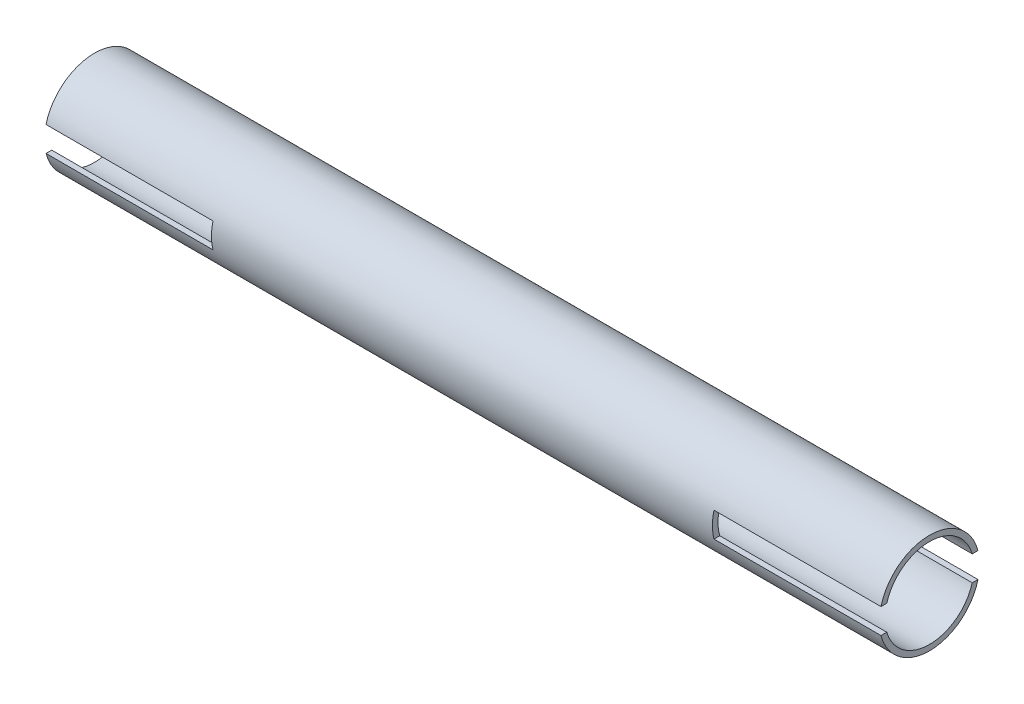
ISO-10303-21;
HEADER;
FILE_DESCRIPTION(('STEP AP214'),'2;1');
FILE_NAME('part.step','',(''),(''),'','','');
FILE_SCHEMA(('AUTOMOTIVE_DESIGN { 1 0 10303 214 1 1 1 1 }'));
ENDSEC;
DATA;
#1=APPLICATION_CONTEXT('core data for automotive mechanical design processes');
#2=APPLICATION_PROTOCOL_DEFINITION('international standard','automotive_design',2000,#1);
#3=PRODUCT_CONTEXT('',#1,'mechanical');
#4=PRODUCT('Part','Part','',(#3));
#5=PRODUCT_RELATED_PRODUCT_CATEGORY('part','',(#4));
#6=PRODUCT_DEFINITION_FORMATION('','',#4);
#7=PRODUCT_DEFINITION_CONTEXT('part definition',#1,'design');
#8=PRODUCT_DEFINITION('design','',#6,#7);
#9=PRODUCT_DEFINITION_SHAPE('','',#8);
#10=(LENGTH_UNIT() NAMED_UNIT(*) SI_UNIT(.MILLI.,.METRE.));
#11=(NAMED_UNIT(*) PLANE_ANGLE_UNIT() SI_UNIT($,.RADIAN.));
#12=(NAMED_UNIT(*) SI_UNIT($,.STERADIAN.) SOLID_ANGLE_UNIT());
#13=UNCERTAINTY_MEASURE_WITH_UNIT(LENGTH_MEASURE(1.E-05),#10,'distance_accuracy_value','');
#14=(GEOMETRIC_REPRESENTATION_CONTEXT(3) GLOBAL_UNCERTAINTY_ASSIGNED_CONTEXT((#13)) GLOBAL_UNIT_ASSIGNED_CONTEXT((#10,
#11,#12)) REPRESENTATION_CONTEXT('',''));
#15=CARTESIAN_POINT('',(0.,0.,0.));
#16=DIRECTION('',(0.,0.,1.));
#17=DIRECTION('',(1.,0.,0.));
#18=AXIS2_PLACEMENT_3D('',#15,#16,#17);
#19=CARTESIAN_POINT('',(-158.75,0.,0.));
#20=DIRECTION('',(1.,0.,0.));
#21=DIRECTION('',(0.,0.,-1.));
#22=AXIS2_PLACEMENT_3D('',#19,#20,#21);
#23=CYLINDRICAL_SURFACE('',#22,16.9418);
#24=DIRECTION('',(1.,0.,0.));
#25=VECTOR('',#24,1.);
#26=CARTESIAN_POINT('',(158.75,4.7625,16.2586340444093));
#27=LINE('',#26,#25);
#28=CARTESIAN_POINT('',(158.75,4.7625,16.2586340444089));
#29=VERTEX_POINT('',#28);
#30=CARTESIAN_POINT('',(95.25,4.7625,16.2586340444089));
#31=VERTEX_POINT('',#30);
#32=EDGE_CURVE('E156',#29,#31,#27,.F.);
#33=ORIENTED_EDGE('',*,*,#32,.T.);
#34=CARTESIAN_POINT('',(95.25,0.,0.));
#35=DIRECTION('',(1.,0.,0.));
#36=DIRECTION('',(0.,0.,-1.));
#37=AXIS2_PLACEMENT_3D('',#34,#35,#36);
#38=CIRCLE('',#37,16.9418);
#39=CARTESIAN_POINT('',(95.25,-4.7625,16.2586340444089));
#40=VERTEX_POINT('',#39);
#41=EDGE_CURVE('E210',#31,#40,#38,.T.);
#42=ORIENTED_EDGE('',*,*,#41,.T.);
#43=DIRECTION('',(1.,0.,0.));
#44=VECTOR('',#43,1.);
#45=CARTESIAN_POINT('',(95.25,-4.7625,16.2586340444093));
#46=LINE('',#45,#44);
#47=CARTESIAN_POINT('',(158.75,-4.7625,16.2586340444089));
#48=VERTEX_POINT('',#47);
#49=EDGE_CURVE('E159',#40,#48,#46,.T.);
#50=ORIENTED_EDGE('',*,*,#49,.T.);
#51=CARTESIAN_POINT('',(158.75,0.,0.));
#52=DIRECTION('',(1.,0.,0.));
#53=DIRECTION('',(0.,0.,-1.));
#54=AXIS2_PLACEMENT_3D('',#51,#52,#53);
#55=CIRCLE('',#54,16.9418);
#56=CARTESIAN_POINT('',(158.75,-4.7625,-16.2586340444089));
#57=VERTEX_POINT('',#56);
#58=EDGE_CURVE('E162',#57,#48,#55,.F.);
#59=ORIENTED_EDGE('',*,*,#58,.F.);
#60=DIRECTION('',(1.,0.,0.));
#61=VECTOR('',#60,1.);
#62=CARTESIAN_POINT('',(95.25,-4.7625,-16.2586340444093));
#63=LINE('',#62,#61);
#64=CARTESIAN_POINT('',(95.25,-4.7625,-16.2586340444089));
#65=VERTEX_POINT('',#64);
#66=EDGE_CURVE('E163',#57,#65,#63,.F.);
#67=ORIENTED_EDGE('',*,*,#66,.T.);
#68=CARTESIAN_POINT('',(95.25,0.,0.));
#69=DIRECTION('',(1.,0.,0.));
#70=DIRECTION('',(0.,0.,-1.));
#71=AXIS2_PLACEMENT_3D('',#68,#69,#70);
#72=CIRCLE('',#71,16.9418);
#73=CARTESIAN_POINT('',(95.25,4.7625,-16.2586340444089));
#74=VERTEX_POINT('',#73);
#75=EDGE_CURVE('E215',#65,#74,#72,.T.);
#76=ORIENTED_EDGE('',*,*,#75,.T.);
#77=DIRECTION('',(1.,0.,0.));
#78=VECTOR('',#77,1.);
#79=CARTESIAN_POINT('',(158.75,4.7625,-16.2586340444093));
#80=LINE('',#79,#78);
#81=CARTESIAN_POINT('',(158.75,4.7625,-16.2586340444089));
#82=VERTEX_POINT('',#81);
#83=EDGE_CURVE('E167',#74,#82,#80,.T.);
#84=ORIENTED_EDGE('',*,*,#83,.T.);
#85=CARTESIAN_POINT('',(158.75,0.,0.));
#86=DIRECTION('',(1.,0.,0.));
#87=DIRECTION('',(0.,0.,-1.));
#88=AXIS2_PLACEMENT_3D('',#85,#86,#87);
#89=CIRCLE('',#88,16.9418);
#90=EDGE_CURVE('E154',#29,#82,#89,.F.);
#91=ORIENTED_EDGE('',*,*,#90,.F.);
#92=EDGE_LOOP('',(#33,#42,#50,#59,#67,#76,#84,#91));
#93=FACE_BOUND('',#92,.T.);
#94=DIRECTION('',(1.,0.,0.));
#95=VECTOR('',#94,1.);
#96=CARTESIAN_POINT('',(-158.75,4.7625,-16.2586340444093));
#97=LINE('',#96,#95);
#98=CARTESIAN_POINT('',(-95.25,4.7625,-16.2586340444089));
#99=VERTEX_POINT('',#98);
#100=CARTESIAN_POINT('',(-158.75,4.7625,-16.2586340444089));
#101=VERTEX_POINT('',#100);
#102=EDGE_CURVE('E155',#99,#101,#97,.F.);
#103=ORIENTED_EDGE('',*,*,#102,.F.);
#104=CARTESIAN_POINT('',(-95.25,0.,0.));
#105=DIRECTION('',(1.,0.,0.));
#106=DIRECTION('',(0.,0.,-1.));
#107=AXIS2_PLACEMENT_3D('',#104,#105,#106);
#108=CIRCLE('',#107,16.9418);
#109=CARTESIAN_POINT('',(-95.25,-4.7625,-16.2586340444089));
#110=VERTEX_POINT('',#109);
#111=EDGE_CURVE('E219',#110,#99,#108,.T.);
#112=ORIENTED_EDGE('',*,*,#111,.F.);
#113=DIRECTION('',(1.,0.,0.));
#114=VECTOR('',#113,1.);
#115=CARTESIAN_POINT('',(-95.25,-4.7625,-16.2586340444093));
#116=LINE('',#115,#114);
#117=CARTESIAN_POINT('',(-158.75,-4.7625,-16.2586340444089));
#118=VERTEX_POINT('',#117);
#119=EDGE_CURVE('E172',#118,#110,#116,.T.);
#120=ORIENTED_EDGE('',*,*,#119,.F.);
#121=CARTESIAN_POINT('',(-158.75,0.,0.));
#122=DIRECTION('',(1.,0.,0.));
#123=DIRECTION('',(0.,0.,-1.));
#124=AXIS2_PLACEMENT_3D('',#121,#122,#123);
#125=CIRCLE('',#124,16.9418);
#126=CARTESIAN_POINT('',(-158.75,-4.7625,16.2586340444089));
#127=VERTEX_POINT('',#126);
#128=EDGE_CURVE('E178',#118,#127,#125,.F.);
#129=ORIENTED_EDGE('',*,*,#128,.T.);
#130=DIRECTION('',(1.,0.,0.));
#131=VECTOR('',#130,1.);
#132=CARTESIAN_POINT('',(-95.25,-4.7625,16.2586340444093));
#133=LINE('',#132,#131);
#134=CARTESIAN_POINT('',(-95.25,-4.7625,16.2586340444089));
#135=VERTEX_POINT('',#134);
#136=EDGE_CURVE('E176',#135,#127,#133,.F.);
#137=ORIENTED_EDGE('',*,*,#136,.F.);
#138=CARTESIAN_POINT('',(-95.25,0.,0.));
#139=DIRECTION('',(1.,0.,0.));
#140=DIRECTION('',(0.,0.,-1.));
#141=AXIS2_PLACEMENT_3D('',#138,#139,#140);
#142=CIRCLE('',#141,16.9418);
#143=CARTESIAN_POINT('',(-95.25,4.7625,16.2586340444089));
#144=VERTEX_POINT('',#143);
#145=EDGE_CURVE('E140',#144,#135,#142,.T.);
#146=ORIENTED_EDGE('',*,*,#145,.F.);
#147=DIRECTION('',(1.,0.,0.));
#148=VECTOR('',#147,1.);
#149=CARTESIAN_POINT('',(-158.75,4.7625,16.2586340444093));
#150=LINE('',#149,#148);
#151=CARTESIAN_POINT('',(-158.75,4.7625,16.2586340444089));
#152=VERTEX_POINT('',#151);
#153=EDGE_CURVE('E138',#152,#144,#150,.T.);
#154=ORIENTED_EDGE('',*,*,#153,.F.);
#155=CARTESIAN_POINT('',(-158.75,0.,0.));
#156=DIRECTION('',(1.,0.,0.));
#157=DIRECTION('',(0.,0.,-1.));
#158=AXIS2_PLACEMENT_3D('',#155,#156,#157);
#159=CIRCLE('',#158,16.9418);
#160=EDGE_CURVE('E19',#152,#101,#159,.F.);
#161=ORIENTED_EDGE('',*,*,#160,.T.);
#162=EDGE_LOOP('',(#103,#112,#120,#129,#137,#146,#154,#161));
#163=FACE_BOUND('',#162,.T.);
#164=ADVANCED_FACE('F16',(#93,#163),#23,.F.);
#165=CARTESIAN_POINT('',(-158.75,0.,0.));
#166=DIRECTION('',(1.,0.,0.));
#167=DIRECTION('',(0.,0.,-1.));
#168=AXIS2_PLACEMENT_3D('',#165,#166,#167);
#169=PLANE('',#168);
#170=CARTESIAN_POINT('',(-158.75,0.,0.));
#171=DIRECTION('',(1.,0.,0.));
#172=DIRECTION('',(0.,0.,-1.));
#173=AXIS2_PLACEMENT_3D('',#170,#171,#172);
#174=CIRCLE('',#173,19.05);
#175=CARTESIAN_POINT('',(-158.75,4.76249999999997,-18.4450831863128));
#176=VERTEX_POINT('',#175);
#177=CARTESIAN_POINT('',(-158.75,4.76249999999997,18.4450831863128));
#178=VERTEX_POINT('',#177);
#179=EDGE_CURVE('E207',#176,#178,#174,.T.);
#180=ORIENTED_EDGE('',*,*,#179,.F.);
#181=DIRECTION('',(0.,0.,-1.));
#182=VECTOR('',#181,1.);
#183=CARTESIAN_POINT('',(-158.75,4.7625,165.2397));
#184=LINE('',#183,#182);
#185=EDGE_CURVE('E133',#101,#176,#184,.T.);
#186=ORIENTED_EDGE('',*,*,#185,.F.);
#187=ORIENTED_EDGE('',*,*,#160,.F.);
#188=DIRECTION('',(0.,0.,-1.));
#189=VECTOR('',#188,1.);
#190=CARTESIAN_POINT('',(-158.75,4.7625,165.2397));
#191=LINE('',#190,#189);
#192=EDGE_CURVE('E130',#178,#152,#191,.T.);
#193=ORIENTED_EDGE('',*,*,#192,.F.);
#194=EDGE_LOOP('',(#180,#186,#187,#193));
#195=FACE_BOUND('',#194,.T.);
#196=ADVANCED_FACE('F128',(#195),#169,.F.);
#197=CARTESIAN_POINT('',(-158.75,4.7625,165.2397));
#198=DIRECTION('',(0.,-1.,0.));
#199=DIRECTION('',(0.,0.,-1.));
#200=AXIS2_PLACEMENT_3D('',#197,#198,#199);
#201=PLANE('',#200);
#202=ORIENTED_EDGE('',*,*,#192,.T.);
#203=ORIENTED_EDGE('',*,*,#153,.T.);
#204=DIRECTION('',(0.,0.,1.));
#205=VECTOR('',#204,1.);
#206=CARTESIAN_POINT('',(-95.25,4.7625,165.2397));
#207=LINE('',#206,#205);
#208=CARTESIAN_POINT('',(-95.25,4.76249999999997,18.4450831863128));
#209=VERTEX_POINT('',#208);
#210=EDGE_CURVE('E143',#209,#144,#207,.F.);
#211=ORIENTED_EDGE('',*,*,#210,.F.);
#212=DIRECTION('',(1.,0.,0.));
#213=VECTOR('',#212,1.);
#214=CARTESIAN_POINT('',(-158.75,4.76249999999994,18.4450831863128));
#215=LINE('',#214,#213);
#216=EDGE_CURVE('E147',#178,#209,#215,.T.);
#217=ORIENTED_EDGE('',*,*,#216,.F.);
#218=EDGE_LOOP('',(#202,#203,#211,#217));
#219=FACE_BOUND('',#218,.T.);
#220=ADVANCED_FACE('F145',(#219),#201,.T.);
#221=CARTESIAN_POINT('',(-95.25,4.7625,165.2397));
#222=DIRECTION('',(-1.,0.,0.));
#223=DIRECTION('',(0.,0.,1.));
#224=AXIS2_PLACEMENT_3D('',#221,#222,#223);
#225=PLANE('',#224);
#226=DIRECTION('',(0.,0.,1.));
#227=VECTOR('',#226,1.);
#228=CARTESIAN_POINT('',(-95.25,-4.7625,165.2397));
#229=LINE('',#228,#227);
#230=CARTESIAN_POINT('',(-95.25,-4.76249999999997,18.4450831863128));
#231=VERTEX_POINT('',#230);
#232=EDGE_CURVE('E179',#231,#135,#229,.F.);
#233=ORIENTED_EDGE('',*,*,#232,.F.);
#234=CARTESIAN_POINT('',(-95.25,0.,0.));
#235=DIRECTION('',(1.,0.,0.));
#236=DIRECTION('',(0.,0.,-1.));
#237=AXIS2_PLACEMENT_3D('',#234,#235,#236);
#238=CIRCLE('',#237,19.05);
#239=EDGE_CURVE('E204',#209,#231,#238,.T.);
#240=ORIENTED_EDGE('',*,*,#239,.F.);
#241=ORIENTED_EDGE('',*,*,#210,.T.);
#242=ORIENTED_EDGE('',*,*,#145,.T.);
#243=EDGE_LOOP('',(#233,#240,#241,#242));
#244=FACE_BOUND('',#243,.T.);
#245=ADVANCED_FACE('F440',(#244),#225,.T.);
#246=CARTESIAN_POINT('',(-95.25,-4.7625,165.2397));
#247=DIRECTION('',(0.,1.,0.));
#248=DIRECTION('',(0.,0.,1.));
#249=AXIS2_PLACEMENT_3D('',#246,#247,#248);
#250=PLANE('',#249);
#251=DIRECTION('',(0.,0.,-1.));
#252=VECTOR('',#251,1.);
#253=CARTESIAN_POINT('',(-158.75,-4.7625,0.));
#254=LINE('',#253,#252);
#255=CARTESIAN_POINT('',(-158.75,-4.76249999999997,18.4450831863128));
#256=VERTEX_POINT('',#255);
#257=EDGE_CURVE('E221',#127,#256,#254,.F.);
#258=ORIENTED_EDGE('',*,*,#257,.T.);
#259=DIRECTION('',(1.,0.,0.));
#260=VECTOR('',#259,1.);
#261=CARTESIAN_POINT('',(-158.75,-4.76249999999993,18.4450831863128));
#262=LINE('',#261,#260);
#263=EDGE_CURVE('E203',#231,#256,#262,.F.);
#264=ORIENTED_EDGE('',*,*,#263,.F.);
#265=ORIENTED_EDGE('',*,*,#232,.T.);
#266=ORIENTED_EDGE('',*,*,#136,.T.);
#267=EDGE_LOOP('',(#258,#264,#265,#266));
#268=FACE_BOUND('',#267,.T.);
#269=ADVANCED_FACE('F431',(#268),#250,.T.);
#270=CARTESIAN_POINT('',(-158.75,0.,0.));
#271=DIRECTION('',(1.,0.,0.));
#272=DIRECTION('',(0.,0.,-1.));
#273=AXIS2_PLACEMENT_3D('',#270,#271,#272);
#274=PLANE('',#273);
#275=ORIENTED_EDGE('',*,*,#128,.F.);
#276=DIRECTION('',(0.,0.,1.));
#277=VECTOR('',#276,1.);
#278=CARTESIAN_POINT('',(-158.75,-4.7625,165.2397));
#279=LINE('',#278,#277);
#280=CARTESIAN_POINT('',(-158.75,-4.76249999999997,-18.4450831863128));
#281=VERTEX_POINT('',#280);
#282=EDGE_CURVE('E175',#281,#118,#279,.T.);
#283=ORIENTED_EDGE('',*,*,#282,.F.);
#284=CARTESIAN_POINT('',(-158.75,0.,0.));
#285=DIRECTION('',(1.,0.,0.));
#286=DIRECTION('',(0.,0.,-1.));
#287=AXIS2_PLACEMENT_3D('',#284,#285,#286);
#288=CIRCLE('',#287,19.05);
#289=EDGE_CURVE('E200',#256,#281,#288,.T.);
#290=ORIENTED_EDGE('',*,*,#289,.F.);
#291=ORIENTED_EDGE('',*,*,#257,.F.);
#292=EDGE_LOOP('',(#275,#283,#290,#291));
#293=FACE_BOUND('',#292,.T.);
#294=ADVANCED_FACE('F422',(#293),#274,.F.);
#295=CARTESIAN_POINT('',(-95.25,-4.7625,165.2397));
#296=DIRECTION('',(0.,1.,0.));
#297=DIRECTION('',(0.,0.,1.));
#298=AXIS2_PLACEMENT_3D('',#295,#296,#297);
#299=PLANE('',#298);
#300=ORIENTED_EDGE('',*,*,#282,.T.);
#301=ORIENTED_EDGE('',*,*,#119,.T.);
#302=DIRECTION('',(0.,0.,1.));
#303=VECTOR('',#302,1.);
#304=CARTESIAN_POINT('',(-95.25,-4.7625,165.2397));
#305=LINE('',#304,#303);
#306=CARTESIAN_POINT('',(-95.25,-4.76249999999997,-18.4450831863128));
#307=VERTEX_POINT('',#306);
#308=EDGE_CURVE('E174',#307,#110,#305,.T.);
#309=ORIENTED_EDGE('',*,*,#308,.F.);
#310=DIRECTION('',(1.,0.,0.));
#311=VECTOR('',#310,1.);
#312=CARTESIAN_POINT('',(-158.75,-4.76249999999994,-18.4450831863128));
#313=LINE('',#312,#311);
#314=EDGE_CURVE('E199',#281,#307,#313,.T.);
#315=ORIENTED_EDGE('',*,*,#314,.F.);
#316=EDGE_LOOP('',(#300,#301,#309,#315));
#317=FACE_BOUND('',#316,.T.);
#318=ADVANCED_FACE('F413',(#317),#299,.T.);
#319=CARTESIAN_POINT('',(-95.25,4.7625,165.2397));
#320=DIRECTION('',(-1.,0.,0.));
#321=DIRECTION('',(0.,0.,1.));
#322=AXIS2_PLACEMENT_3D('',#319,#320,#321);
#323=PLANE('',#322);
#324=ORIENTED_EDGE('',*,*,#308,.T.);
#325=ORIENTED_EDGE('',*,*,#111,.T.);
#326=DIRECTION('',(0.,0.,-1.));
#327=VECTOR('',#326,1.);
#328=CARTESIAN_POINT('',(-95.25,4.7625,165.2397));
#329=LINE('',#328,#327);
#330=CARTESIAN_POINT('',(-95.25,4.76249999999997,-18.4450831863128));
#331=VERTEX_POINT('',#330);
#332=EDGE_CURVE('E171',#331,#99,#329,.F.);
#333=ORIENTED_EDGE('',*,*,#332,.F.);
#334=CARTESIAN_POINT('',(-95.25,0.,0.));
#335=DIRECTION('',(1.,0.,0.));
#336=DIRECTION('',(0.,0.,-1.));
#337=AXIS2_PLACEMENT_3D('',#334,#335,#336);
#338=CIRCLE('',#337,19.05);
#339=EDGE_CURVE('E196',#307,#331,#338,.T.);
#340=ORIENTED_EDGE('',*,*,#339,.F.);
#341=EDGE_LOOP('',(#324,#325,#333,#340));
#342=FACE_BOUND('',#341,.T.);
#343=ADVANCED_FACE('F404',(#342),#323,.T.);
#344=CARTESIAN_POINT('',(-158.75,4.7625,165.2397));
#345=DIRECTION('',(0.,-1.,0.));
#346=DIRECTION('',(0.,0.,-1.));
#347=AXIS2_PLACEMENT_3D('',#344,#345,#346);
#348=PLANE('',#347);
#349=ORIENTED_EDGE('',*,*,#185,.T.);
#350=DIRECTION('',(1.,0.,0.));
#351=VECTOR('',#350,1.);
#352=CARTESIAN_POINT('',(-158.75,4.76249999999994,-18.4450831863128));
#353=LINE('',#352,#351);
#354=EDGE_CURVE('E195',#331,#176,#353,.F.);
#355=ORIENTED_EDGE('',*,*,#354,.F.);
#356=ORIENTED_EDGE('',*,*,#332,.T.);
#357=ORIENTED_EDGE('',*,*,#102,.T.);
#358=EDGE_LOOP('',(#349,#355,#356,#357));
#359=FACE_BOUND('',#358,.T.);
#360=ADVANCED_FACE('F396',(#359),#348,.T.);
#361=CARTESIAN_POINT('',(158.75,0.,0.));
#362=DIRECTION('',(1.,0.,0.));
#363=DIRECTION('',(0.,0.,-1.));
#364=AXIS2_PLACEMENT_3D('',#361,#362,#363);
#365=PLANE('',#364);
#366=DIRECTION('',(0.,0.,1.));
#367=VECTOR('',#366,1.);
#368=CARTESIAN_POINT('',(158.75,4.7625,165.2397));
#369=LINE('',#368,#367);
#370=CARTESIAN_POINT('',(158.75,4.76249999999997,-18.4450831863128));
#371=VERTEX_POINT('',#370);
#372=EDGE_CURVE('E169',#82,#371,#369,.F.);
#373=ORIENTED_EDGE('',*,*,#372,.T.);
#374=CARTESIAN_POINT('',(158.75,0.,0.));
#375=DIRECTION('',(1.,0.,0.));
#376=DIRECTION('',(0.,0.,-1.));
#377=AXIS2_PLACEMENT_3D('',#374,#375,#376);
#378=CIRCLE('',#377,19.05);
#379=CARTESIAN_POINT('',(158.75,4.76249999999997,18.4450831863128));
#380=VERTEX_POINT('',#379);
#381=EDGE_CURVE('E192',#380,#371,#378,.F.);
#382=ORIENTED_EDGE('',*,*,#381,.F.);
#383=DIRECTION('',(0.,0.,1.));
#384=VECTOR('',#383,1.);
#385=CARTESIAN_POINT('',(158.75,4.7625,165.2397));
#386=LINE('',#385,#384);
#387=EDGE_CURVE('E209',#380,#29,#386,.F.);
#388=ORIENTED_EDGE('',*,*,#387,.T.);
#389=ORIENTED_EDGE('',*,*,#90,.T.);
#390=EDGE_LOOP('',(#373,#382,#388,#389));
#391=FACE_BOUND('',#390,.T.);
#392=ADVANCED_FACE('F278',(#391),#365,.T.);
#393=CARTESIAN_POINT('',(158.75,4.7625,165.2397));
#394=DIRECTION('',(0.,1.,0.));
#395=DIRECTION('',(0.,0.,1.));
#396=AXIS2_PLACEMENT_3D('',#393,#394,#395);
#397=PLANE('',#396);
#398=ORIENTED_EDGE('',*,*,#83,.F.);
#399=DIRECTION('',(0.,0.,1.));
#400=VECTOR('',#399,1.);
#401=CARTESIAN_POINT('',(95.25,4.7625,165.2397));
#402=LINE('',#401,#400);
#403=CARTESIAN_POINT('',(95.25,4.76249999999997,-18.4450831863128));
#404=VERTEX_POINT('',#403);
#405=EDGE_CURVE('E166',#74,#404,#402,.F.);
#406=ORIENTED_EDGE('',*,*,#405,.T.);
#407=DIRECTION('',(1.,0.,0.));
#408=VECTOR('',#407,1.);
#409=CARTESIAN_POINT('',(-158.75,4.76249999999994,-18.4450831863128));
#410=LINE('',#409,#408);
#411=EDGE_CURVE('E191',#371,#404,#410,.F.);
#412=ORIENTED_EDGE('',*,*,#411,.F.);
#413=ORIENTED_EDGE('',*,*,#372,.F.);
#414=EDGE_LOOP('',(#398,#406,#412,#413));
#415=FACE_BOUND('',#414,.T.);
#416=ADVANCED_FACE('F282',(#415),#397,.F.);
#417=CARTESIAN_POINT('',(95.25,4.7625,165.2397));
#418=DIRECTION('',(-1.,0.,0.));
#419=DIRECTION('',(0.,0.,1.));
#420=AXIS2_PLACEMENT_3D('',#417,#418,#419);
#421=PLANE('',#420);
#422=ORIENTED_EDGE('',*,*,#405,.F.);
#423=ORIENTED_EDGE('',*,*,#75,.F.);
#424=DIRECTION('',(0.,0.,-1.));
#425=VECTOR('',#424,1.);
#426=CARTESIAN_POINT('',(95.25,-4.7625,165.2397));
#427=LINE('',#426,#425);
#428=CARTESIAN_POINT('',(95.25,-4.76249999999997,-18.4450831863128));
#429=VERTEX_POINT('',#428);
#430=EDGE_CURVE('E165',#65,#429,#427,.T.);
#431=ORIENTED_EDGE('',*,*,#430,.T.);
#432=CARTESIAN_POINT('',(95.25,0.,0.));
#433=DIRECTION('',(1.,0.,0.));
#434=DIRECTION('',(0.,0.,-1.));
#435=AXIS2_PLACEMENT_3D('',#432,#433,#434);
#436=CIRCLE('',#435,19.05);
#437=EDGE_CURVE('E188',#404,#429,#436,.F.);
#438=ORIENTED_EDGE('',*,*,#437,.F.);
#439=EDGE_LOOP('',(#422,#423,#431,#438));
#440=FACE_BOUND('',#439,.T.);
#441=ADVANCED_FACE('F286',(#440),#421,.F.);
#442=CARTESIAN_POINT('',(95.25,-4.7625,165.2397));
#443=DIRECTION('',(0.,-1.,0.));
#444=DIRECTION('',(0.,0.,-1.));
#445=AXIS2_PLACEMENT_3D('',#442,#443,#444);
#446=PLANE('',#445);
#447=DIRECTION('',(1.,0.,0.));
#448=VECTOR('',#447,1.);
#449=CARTESIAN_POINT('',(-158.75,-4.76249999999994,-18.4450831863128));
#450=LINE('',#449,#448);
#451=CARTESIAN_POINT('',(158.75,-4.76249999999997,-18.4450831863128));
#452=VERTEX_POINT('',#451);
#453=EDGE_CURVE('E187',#429,#452,#450,.T.);
#454=ORIENTED_EDGE('',*,*,#453,.F.);
#455=ORIENTED_EDGE('',*,*,#430,.F.);
#456=ORIENTED_EDGE('',*,*,#66,.F.);
#457=DIRECTION('',(0.,0.,-1.));
#458=VECTOR('',#457,1.);
#459=CARTESIAN_POINT('',(158.75,-4.7625,0.));
#460=LINE('',#459,#458);
#461=EDGE_CURVE('E214',#452,#57,#460,.F.);
#462=ORIENTED_EDGE('',*,*,#461,.F.);
#463=EDGE_LOOP('',(#454,#455,#456,#462));
#464=FACE_BOUND('',#463,.T.);
#465=ADVANCED_FACE('F289',(#464),#446,.F.);
#466=CARTESIAN_POINT('',(158.75,0.,0.));
#467=DIRECTION('',(1.,0.,0.));
#468=DIRECTION('',(0.,0.,-1.));
#469=AXIS2_PLACEMENT_3D('',#466,#467,#468);
#470=PLANE('',#469);
#471=ORIENTED_EDGE('',*,*,#461,.T.);
#472=ORIENTED_EDGE('',*,*,#58,.T.);
#473=DIRECTION('',(0.,0.,-1.));
#474=VECTOR('',#473,1.);
#475=CARTESIAN_POINT('',(158.75,-4.7625,165.2397));
#476=LINE('',#475,#474);
#477=CARTESIAN_POINT('',(158.75,-4.76249999999997,18.4450831863128));
#478=VERTEX_POINT('',#477);
#479=EDGE_CURVE('E161',#48,#478,#476,.F.);
#480=ORIENTED_EDGE('',*,*,#479,.T.);
#481=CARTESIAN_POINT('',(158.75,0.,0.));
#482=DIRECTION('',(1.,0.,0.));
#483=DIRECTION('',(0.,0.,-1.));
#484=AXIS2_PLACEMENT_3D('',#481,#482,#483);
#485=CIRCLE('',#484,19.05);
#486=EDGE_CURVE('E184',#452,#478,#485,.F.);
#487=ORIENTED_EDGE('',*,*,#486,.F.);
#488=EDGE_LOOP('',(#471,#472,#480,#487));
#489=FACE_BOUND('',#488,.T.);
#490=ADVANCED_FACE('F268',(#489),#470,.T.);
#491=CARTESIAN_POINT('',(95.25,-4.7625,165.2397));
#492=DIRECTION('',(0.,-1.,0.));
#493=DIRECTION('',(0.,0.,-1.));
#494=AXIS2_PLACEMENT_3D('',#491,#492,#493);
#495=PLANE('',#494);
#496=ORIENTED_EDGE('',*,*,#49,.F.);
#497=DIRECTION('',(0.,0.,1.));
#498=VECTOR('',#497,1.);
#499=CARTESIAN_POINT('',(95.25,-4.7625,165.2397));
#500=LINE('',#499,#498);
#501=CARTESIAN_POINT('',(95.25,-4.76249999999997,18.4450831863128));
#502=VERTEX_POINT('',#501);
#503=EDGE_CURVE('E158',#40,#502,#500,.T.);
#504=ORIENTED_EDGE('',*,*,#503,.T.);
#505=DIRECTION('',(1.,0.,0.));
#506=VECTOR('',#505,1.);
#507=CARTESIAN_POINT('',(-158.75,-4.76249999999993,18.4450831863128));
#508=LINE('',#507,#506);
#509=EDGE_CURVE('E183',#478,#502,#508,.F.);
#510=ORIENTED_EDGE('',*,*,#509,.F.);
#511=ORIENTED_EDGE('',*,*,#479,.F.);
#512=EDGE_LOOP('',(#496,#504,#510,#511));
#513=FACE_BOUND('',#512,.T.);
#514=ADVANCED_FACE('F259',(#513),#495,.F.);
#515=CARTESIAN_POINT('',(95.25,4.7625,165.2397));
#516=DIRECTION('',(-1.,0.,0.));
#517=DIRECTION('',(0.,0.,1.));
#518=AXIS2_PLACEMENT_3D('',#515,#516,#517);
#519=PLANE('',#518);
#520=ORIENTED_EDGE('',*,*,#503,.F.);
#521=ORIENTED_EDGE('',*,*,#41,.F.);
#522=DIRECTION('',(0.,0.,1.));
#523=VECTOR('',#522,1.);
#524=CARTESIAN_POINT('',(95.25,4.7625,165.2397));
#525=LINE('',#524,#523);
#526=CARTESIAN_POINT('',(95.25,4.76249999999997,18.4450831863128));
#527=VERTEX_POINT('',#526);
#528=EDGE_CURVE('E34',#31,#527,#525,.T.);
#529=ORIENTED_EDGE('',*,*,#528,.T.);
#530=CARTESIAN_POINT('',(95.25,0.,0.));
#531=DIRECTION('',(1.,0.,0.));
#532=DIRECTION('',(0.,0.,-1.));
#533=AXIS2_PLACEMENT_3D('',#530,#531,#532);
#534=CIRCLE('',#533,19.05);
#535=EDGE_CURVE('E25',#502,#527,#534,.F.);
#536=ORIENTED_EDGE('',*,*,#535,.F.);
#537=EDGE_LOOP('',(#520,#521,#529,#536));
#538=FACE_BOUND('',#537,.T.);
#539=ADVANCED_FACE('F261',(#538),#519,.F.);
#540=CARTESIAN_POINT('',(158.75,4.7625,165.2397));
#541=DIRECTION('',(0.,1.,0.));
#542=DIRECTION('',(0.,0.,1.));
#543=AXIS2_PLACEMENT_3D('',#540,#541,#542);
#544=PLANE('',#543);
#545=DIRECTION('',(1.,0.,0.));
#546=VECTOR('',#545,1.);
#547=CARTESIAN_POINT('',(-158.75,4.76249999999994,18.4450831863128));
#548=LINE('',#547,#546);
#549=EDGE_CURVE('E11',#527,#380,#548,.T.);
#550=ORIENTED_EDGE('',*,*,#549,.F.);
#551=ORIENTED_EDGE('',*,*,#528,.F.);
#552=ORIENTED_EDGE('',*,*,#32,.F.);
#553=ORIENTED_EDGE('',*,*,#387,.F.);
#554=EDGE_LOOP('',(#550,#551,#552,#553));
#555=FACE_BOUND('',#554,.T.);
#556=ADVANCED_FACE('F274',(#555),#544,.F.);
#557=CARTESIAN_POINT('',(-158.75,0.,0.));
#558=DIRECTION('',(1.,0.,0.));
#559=DIRECTION('',(0.,0.,-1.));
#560=AXIS2_PLACEMENT_3D('',#557,#558,#559);
#561=CYLINDRICAL_SURFACE('',#560,19.05);
#562=ORIENTED_EDGE('',*,*,#535,.T.);
#563=ORIENTED_EDGE('',*,*,#549,.T.);
#564=ORIENTED_EDGE('',*,*,#381,.T.);
#565=ORIENTED_EDGE('',*,*,#411,.T.);
#566=ORIENTED_EDGE('',*,*,#437,.T.);
#567=ORIENTED_EDGE('',*,*,#453,.T.);
#568=ORIENTED_EDGE('',*,*,#486,.T.);
#569=ORIENTED_EDGE('',*,*,#509,.T.);
#570=EDGE_LOOP('',(#562,#563,#564,#565,#566,#567,#568,#569));
#571=FACE_BOUND('',#570,.T.);
#572=ORIENTED_EDGE('',*,*,#339,.T.);
#573=ORIENTED_EDGE('',*,*,#354,.T.);
#574=ORIENTED_EDGE('',*,*,#179,.T.);
#575=ORIENTED_EDGE('',*,*,#216,.T.);
#576=ORIENTED_EDGE('',*,*,#239,.T.);
#577=ORIENTED_EDGE('',*,*,#263,.T.);
#578=ORIENTED_EDGE('',*,*,#289,.T.);
#579=ORIENTED_EDGE('',*,*,#314,.T.);
#580=EDGE_LOOP('',(#572,#573,#574,#575,#576,#577,#578,#579));
#581=FACE_BOUND('',#580,.T.);
#582=ADVANCED_FACE('F263',(#571,#581),#561,.T.);
#583=CLOSED_SHELL('',(#164,#196,#220,#245,#269,#294,#318,#343,#360,#392,#416,#441,#465,#490,
#514,#539,#556,#582));
#584=MANIFOLD_SOLID_BREP('B1',#583);
#585=ADVANCED_BREP_SHAPE_REPRESENTATION('',(#18,#584),#14);
#586=SHAPE_DEFINITION_REPRESENTATION(#9,#585);
ENDSEC;
END-ISO-10303-21;
